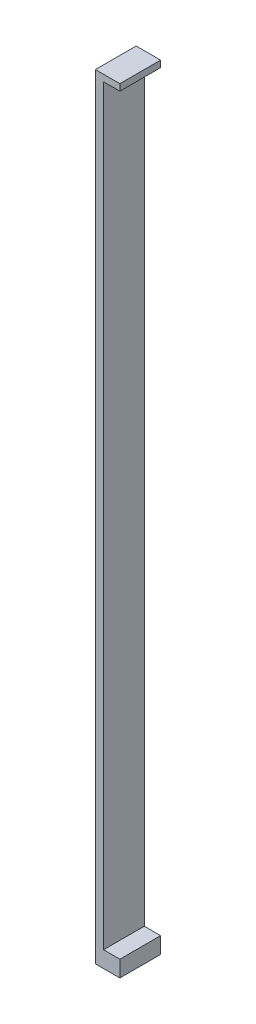
ISO-10303-21;
HEADER;
FILE_DESCRIPTION(('STEP AP214'),'2;1');
FILE_NAME('part.step','',(''),(''),'','','');
FILE_SCHEMA(('AUTOMOTIVE_DESIGN { 1 0 10303 214 1 1 1 1 }'));
ENDSEC;
DATA;
#1=APPLICATION_CONTEXT('core data for automotive mechanical design processes');
#2=APPLICATION_PROTOCOL_DEFINITION('international standard','automotive_design',2000,#1);
#3=PRODUCT_CONTEXT('',#1,'mechanical');
#4=PRODUCT('Part','Part','',(#3));
#5=PRODUCT_RELATED_PRODUCT_CATEGORY('part','',(#4));
#6=PRODUCT_DEFINITION_FORMATION('','',#4);
#7=PRODUCT_DEFINITION_CONTEXT('part definition',#1,'design');
#8=PRODUCT_DEFINITION('design','',#6,#7);
#9=PRODUCT_DEFINITION_SHAPE('','',#8);
#10=(LENGTH_UNIT() NAMED_UNIT(*) SI_UNIT(.MILLI.,.METRE.));
#11=(NAMED_UNIT(*) PLANE_ANGLE_UNIT() SI_UNIT($,.RADIAN.));
#12=(NAMED_UNIT(*) SI_UNIT($,.STERADIAN.) SOLID_ANGLE_UNIT());
#13=UNCERTAINTY_MEASURE_WITH_UNIT(LENGTH_MEASURE(1.E-05),#10,'distance_accuracy_value','');
#14=(GEOMETRIC_REPRESENTATION_CONTEXT(3) GLOBAL_UNCERTAINTY_ASSIGNED_CONTEXT((#13)) GLOBAL_UNIT_ASSIGNED_CONTEXT((#10,
#11,#12)) REPRESENTATION_CONTEXT('',''));
#15=CARTESIAN_POINT('',(0.,0.,0.));
#16=DIRECTION('',(0.,0.,1.));
#17=DIRECTION('',(1.,0.,0.));
#18=AXIS2_PLACEMENT_3D('',#15,#16,#17);
#19=CARTESIAN_POINT('',(3.,0.,0.));
#20=DIRECTION('',(-1.,0.,0.));
#21=DIRECTION('',(0.,0.,1.));
#22=AXIS2_PLACEMENT_3D('',#19,#20,#21);
#23=PLANE('',#22);
#24=DIRECTION('',(0.,1.,0.));
#25=VECTOR('',#24,1.);
#26=CARTESIAN_POINT('',(3.,0.,0.));
#27=LINE('',#26,#25);
#28=CARTESIAN_POINT('',(3.,0.,0.));
#29=VERTEX_POINT('',#28);
#30=CARTESIAN_POINT('',(3.,2.,0.));
#31=VERTEX_POINT('',#30);
#32=EDGE_CURVE('E92',#29,#31,#27,.T.);
#33=ORIENTED_EDGE('',*,*,#32,.T.);
#34=DIRECTION('',(0.,0.,-1.));
#35=VECTOR('',#34,1.);
#36=CARTESIAN_POINT('',(3.,2.,5.));
#37=LINE('',#36,#35);
#38=CARTESIAN_POINT('',(3.,2.,5.));
#39=VERTEX_POINT('',#38);
#40=EDGE_CURVE('E118',#39,#31,#37,.T.);
#41=ORIENTED_EDGE('',*,*,#40,.F.);
#42=DIRECTION('',(0.,-1.,0.));
#43=VECTOR('',#42,1.);
#44=CARTESIAN_POINT('',(3.,0.,5.));
#45=LINE('',#44,#43);
#46=CARTESIAN_POINT('',(3.,0.,5.));
#47=VERTEX_POINT('',#46);
#48=EDGE_CURVE('E63',#39,#47,#45,.T.);
#49=ORIENTED_EDGE('',*,*,#48,.T.);
#50=DIRECTION('',(0.,0.,-1.));
#51=VECTOR('',#50,1.);
#52=CARTESIAN_POINT('',(3.,0.,0.));
#53=LINE('',#52,#51);
#54=EDGE_CURVE('E147',#47,#29,#53,.T.);
#55=ORIENTED_EDGE('',*,*,#54,.T.);
#56=EDGE_LOOP('',(#33,#41,#49,#55));
#57=FACE_BOUND('',#56,.T.);
#58=ADVANCED_FACE('F39',(#57),#23,.F.);
#59=CARTESIAN_POINT('',(3.,0.,0.));
#60=DIRECTION('',(0.,1.,0.));
#61=DIRECTION('',(0.,0.,1.));
#62=AXIS2_PLACEMENT_3D('',#59,#60,#61);
#63=PLANE('',#62);
#64=DIRECTION('',(0.,0.,-1.));
#65=VECTOR('',#64,1.);
#66=CARTESIAN_POINT('',(0.,0.,0.));
#67=LINE('',#66,#65);
#68=CARTESIAN_POINT('',(0.,0.,5.));
#69=VERTEX_POINT('',#68);
#70=CARTESIAN_POINT('',(0.,0.,0.));
#71=VERTEX_POINT('',#70);
#72=EDGE_CURVE('E142',#69,#71,#67,.T.);
#73=ORIENTED_EDGE('',*,*,#72,.T.);
#74=DIRECTION('',(-1.,0.,0.));
#75=VECTOR('',#74,1.);
#76=CARTESIAN_POINT('',(3.,0.,0.));
#77=LINE('',#76,#75);
#78=EDGE_CURVE('E11',#29,#71,#77,.T.);
#79=ORIENTED_EDGE('',*,*,#78,.F.);
#80=ORIENTED_EDGE('',*,*,#54,.F.);
#81=DIRECTION('',(-1.,0.,0.));
#82=VECTOR('',#81,1.);
#83=CARTESIAN_POINT('',(3.,0.,5.));
#84=LINE('',#83,#82);
#85=EDGE_CURVE('E156',#47,#69,#84,.T.);
#86=ORIENTED_EDGE('',*,*,#85,.T.);
#87=EDGE_LOOP('',(#73,#79,#80,#86));
#88=FACE_BOUND('',#87,.T.);
#89=ADVANCED_FACE('F41',(#88),#63,.F.);
#90=CARTESIAN_POINT('',(3.,0.,0.));
#91=DIRECTION('',(0.,0.,1.));
#92=DIRECTION('',(1.,0.,0.));
#93=AXIS2_PLACEMENT_3D('',#90,#91,#92);
#94=PLANE('',#93);
#95=DIRECTION('',(0.,1.,0.));
#96=VECTOR('',#95,1.);
#97=CARTESIAN_POINT('',(1.,2.,0.));
#98=LINE('',#97,#96);
#99=CARTESIAN_POINT('',(1.,2.,0.));
#100=VERTEX_POINT('',#99);
#101=CARTESIAN_POINT('',(1.,94.2,0.));
#102=VERTEX_POINT('',#101);
#103=EDGE_CURVE('E126',#100,#102,#98,.T.);
#104=ORIENTED_EDGE('',*,*,#103,.F.);
#105=DIRECTION('',(1.,0.,0.));
#106=VECTOR('',#105,1.);
#107=CARTESIAN_POINT('',(1.,2.,0.));
#108=LINE('',#107,#106);
#109=EDGE_CURVE('E113',#100,#31,#108,.T.);
#110=ORIENTED_EDGE('',*,*,#109,.T.);
#111=ORIENTED_EDGE('',*,*,#32,.F.);
#112=ORIENTED_EDGE('',*,*,#78,.T.);
#113=DIRECTION('',(0.,1.,0.));
#114=VECTOR('',#113,1.);
#115=CARTESIAN_POINT('',(0.,0.,0.));
#116=LINE('',#115,#114);
#117=CARTESIAN_POINT('',(0.,95.,0.));
#118=VERTEX_POINT('',#117);
#119=EDGE_CURVE('E159',#71,#118,#116,.T.);
#120=ORIENTED_EDGE('',*,*,#119,.T.);
#121=DIRECTION('',(-1.,0.,0.));
#122=VECTOR('',#121,1.);
#123=CARTESIAN_POINT('',(3.,95.,0.));
#124=LINE('',#123,#122);
#125=CARTESIAN_POINT('',(3.,95.,0.));
#126=VERTEX_POINT('',#125);
#127=EDGE_CURVE('E47',#126,#118,#124,.T.);
#128=ORIENTED_EDGE('',*,*,#127,.F.);
#129=CARTESIAN_POINT('',(3.,94.2,0.));
#130=VERTEX_POINT('',#129);
#131=EDGE_CURVE('E149',#130,#126,#27,.T.);
#132=ORIENTED_EDGE('',*,*,#131,.F.);
#133=DIRECTION('',(1.,0.,0.));
#134=VECTOR('',#133,1.);
#135=CARTESIAN_POINT('',(1.,94.2,0.));
#136=LINE('',#135,#134);
#137=EDGE_CURVE('E54',#102,#130,#136,.T.);
#138=ORIENTED_EDGE('',*,*,#137,.F.);
#139=EDGE_LOOP('',(#104,#110,#111,#112,#120,#128,#132,#138));
#140=FACE_BOUND('',#139,.T.);
#141=ADVANCED_FACE('F131',(#140),#94,.F.);
#142=CARTESIAN_POINT('',(3.,95.,0.));
#143=DIRECTION('',(0.,-1.,0.));
#144=DIRECTION('',(0.,0.,-1.));
#145=AXIS2_PLACEMENT_3D('',#142,#143,#144);
#146=PLANE('',#145);
#147=DIRECTION('',(0.,0.,1.));
#148=VECTOR('',#147,1.);
#149=CARTESIAN_POINT('',(0.,95.,0.));
#150=LINE('',#149,#148);
#151=CARTESIAN_POINT('',(0.,95.,5.));
#152=VERTEX_POINT('',#151);
#153=EDGE_CURVE('E161',#118,#152,#150,.T.);
#154=ORIENTED_EDGE('',*,*,#153,.T.);
#155=DIRECTION('',(-1.,0.,0.));
#156=VECTOR('',#155,1.);
#157=CARTESIAN_POINT('',(3.,95.,5.));
#158=LINE('',#157,#156);
#159=CARTESIAN_POINT('',(3.,95.,5.));
#160=VERTEX_POINT('',#159);
#161=EDGE_CURVE('E165',#160,#152,#158,.T.);
#162=ORIENTED_EDGE('',*,*,#161,.F.);
#163=DIRECTION('',(0.,0.,1.));
#164=VECTOR('',#163,1.);
#165=CARTESIAN_POINT('',(3.,95.,0.));
#166=LINE('',#165,#164);
#167=EDGE_CURVE('E151',#126,#160,#166,.T.);
#168=ORIENTED_EDGE('',*,*,#167,.F.);
#169=ORIENTED_EDGE('',*,*,#127,.T.);
#170=EDGE_LOOP('',(#154,#162,#168,#169));
#171=FACE_BOUND('',#170,.T.);
#172=ADVANCED_FACE('F171',(#171),#146,.F.);
#173=CARTESIAN_POINT('',(3.,0.,5.));
#174=DIRECTION('',(0.,0.,-1.));
#175=DIRECTION('',(-1.,0.,0.));
#176=AXIS2_PLACEMENT_3D('',#173,#174,#175);
#177=PLANE('',#176);
#178=ORIENTED_EDGE('',*,*,#48,.F.);
#179=DIRECTION('',(1.,0.,0.));
#180=VECTOR('',#179,1.);
#181=CARTESIAN_POINT('',(1.,2.,5.));
#182=LINE('',#181,#180);
#183=CARTESIAN_POINT('',(1.,2.,5.));
#184=VERTEX_POINT('',#183);
#185=EDGE_CURVE('E140',#184,#39,#182,.T.);
#186=ORIENTED_EDGE('',*,*,#185,.F.);
#187=DIRECTION('',(0.,-1.,0.));
#188=VECTOR('',#187,1.);
#189=CARTESIAN_POINT('',(1.,2.,5.));
#190=LINE('',#189,#188);
#191=CARTESIAN_POINT('',(1.,94.2,5.));
#192=VERTEX_POINT('',#191);
#193=EDGE_CURVE('E120',#192,#184,#190,.T.);
#194=ORIENTED_EDGE('',*,*,#193,.F.);
#195=DIRECTION('',(1.,0.,0.));
#196=VECTOR('',#195,1.);
#197=CARTESIAN_POINT('',(1.,94.2,5.));
#198=LINE('',#197,#196);
#199=CARTESIAN_POINT('',(3.,94.2,5.));
#200=VERTEX_POINT('',#199);
#201=EDGE_CURVE('E143',#192,#200,#198,.T.);
#202=ORIENTED_EDGE('',*,*,#201,.T.);
#203=EDGE_CURVE('E153',#160,#200,#45,.T.);
#204=ORIENTED_EDGE('',*,*,#203,.F.);
#205=ORIENTED_EDGE('',*,*,#161,.T.);
#206=DIRECTION('',(0.,-1.,0.));
#207=VECTOR('',#206,1.);
#208=CARTESIAN_POINT('',(0.,0.,5.));
#209=LINE('',#208,#207);
#210=EDGE_CURVE('E85',#152,#69,#209,.T.);
#211=ORIENTED_EDGE('',*,*,#210,.T.);
#212=ORIENTED_EDGE('',*,*,#85,.F.);
#213=EDGE_LOOP('',(#178,#186,#194,#202,#204,#205,#211,#212));
#214=FACE_BOUND('',#213,.T.);
#215=ADVANCED_FACE('F179',(#214),#177,.F.);
#216=ORIENTED_EDGE('',*,*,#203,.T.);
#217=DIRECTION('',(0.,0.,1.));
#218=VECTOR('',#217,1.);
#219=CARTESIAN_POINT('',(3.,94.2,5.));
#220=LINE('',#219,#218);
#221=EDGE_CURVE('E129',#130,#200,#220,.T.);
#222=ORIENTED_EDGE('',*,*,#221,.F.);
#223=ORIENTED_EDGE('',*,*,#131,.T.);
#224=ORIENTED_EDGE('',*,*,#167,.T.);
#225=EDGE_LOOP('',(#216,#222,#223,#224));
#226=FACE_BOUND('',#225,.T.);
#227=ADVANCED_FACE('F182',(#226),#23,.F.);
#228=CARTESIAN_POINT('',(0.,0.,0.));
#229=DIRECTION('',(-1.,0.,0.));
#230=DIRECTION('',(0.,0.,1.));
#231=AXIS2_PLACEMENT_3D('',#228,#229,#230);
#232=PLANE('',#231);
#233=ORIENTED_EDGE('',*,*,#72,.F.);
#234=ORIENTED_EDGE('',*,*,#210,.F.);
#235=ORIENTED_EDGE('',*,*,#153,.F.);
#236=ORIENTED_EDGE('',*,*,#119,.F.);
#237=EDGE_LOOP('',(#233,#234,#235,#236));
#238=FACE_BOUND('',#237,.T.);
#239=ADVANCED_FACE('F175',(#238),#232,.T.);
#240=CARTESIAN_POINT('',(1.,2.,5.));
#241=DIRECTION('',(0.,-1.,0.));
#242=DIRECTION('',(0.,0.,-1.));
#243=AXIS2_PLACEMENT_3D('',#240,#241,#242);
#244=PLANE('',#243);
#245=ORIENTED_EDGE('',*,*,#40,.T.);
#246=ORIENTED_EDGE('',*,*,#109,.F.);
#247=DIRECTION('',(0.,0.,-1.));
#248=VECTOR('',#247,1.);
#249=CARTESIAN_POINT('',(1.,2.,5.));
#250=LINE('',#249,#248);
#251=EDGE_CURVE('E116',#184,#100,#250,.T.);
#252=ORIENTED_EDGE('',*,*,#251,.F.);
#253=ORIENTED_EDGE('',*,*,#185,.T.);
#254=EDGE_LOOP('',(#245,#246,#252,#253));
#255=FACE_BOUND('',#254,.T.);
#256=ADVANCED_FACE('F115',(#255),#244,.F.);
#257=CARTESIAN_POINT('',(1.,94.2,5.));
#258=DIRECTION('',(0.,1.,0.));
#259=DIRECTION('',(0.,0.,1.));
#260=AXIS2_PLACEMENT_3D('',#257,#258,#259);
#261=PLANE('',#260);
#262=ORIENTED_EDGE('',*,*,#221,.T.);
#263=ORIENTED_EDGE('',*,*,#201,.F.);
#264=DIRECTION('',(0.,0.,1.));
#265=VECTOR('',#264,1.);
#266=CARTESIAN_POINT('',(1.,94.2,5.));
#267=LINE('',#266,#265);
#268=EDGE_CURVE('E133',#102,#192,#267,.T.);
#269=ORIENTED_EDGE('',*,*,#268,.F.);
#270=ORIENTED_EDGE('',*,*,#137,.T.);
#271=EDGE_LOOP('',(#262,#263,#269,#270));
#272=FACE_BOUND('',#271,.T.);
#273=ADVANCED_FACE('F198',(#272),#261,.F.);
#274=CARTESIAN_POINT('',(1.,0.,0.));
#275=DIRECTION('',(1.,0.,0.));
#276=DIRECTION('',(0.,0.,-1.));
#277=AXIS2_PLACEMENT_3D('',#274,#275,#276);
#278=PLANE('',#277);
#279=ORIENTED_EDGE('',*,*,#251,.T.);
#280=ORIENTED_EDGE('',*,*,#103,.T.);
#281=ORIENTED_EDGE('',*,*,#268,.T.);
#282=ORIENTED_EDGE('',*,*,#193,.T.);
#283=EDGE_LOOP('',(#279,#280,#281,#282));
#284=FACE_BOUND('',#283,.T.);
#285=ADVANCED_FACE('F124',(#284),#278,.T.);
#286=CLOSED_SHELL('',(#58,#89,#141,#172,#215,#227,#239,#256,#273,#285));
#287=MANIFOLD_SOLID_BREP('B2',#286);
#288=ADVANCED_BREP_SHAPE_REPRESENTATION('',(#18,#287),#14);
#289=SHAPE_DEFINITION_REPRESENTATION(#9,#288);
ENDSEC;
END-ISO-10303-21;
